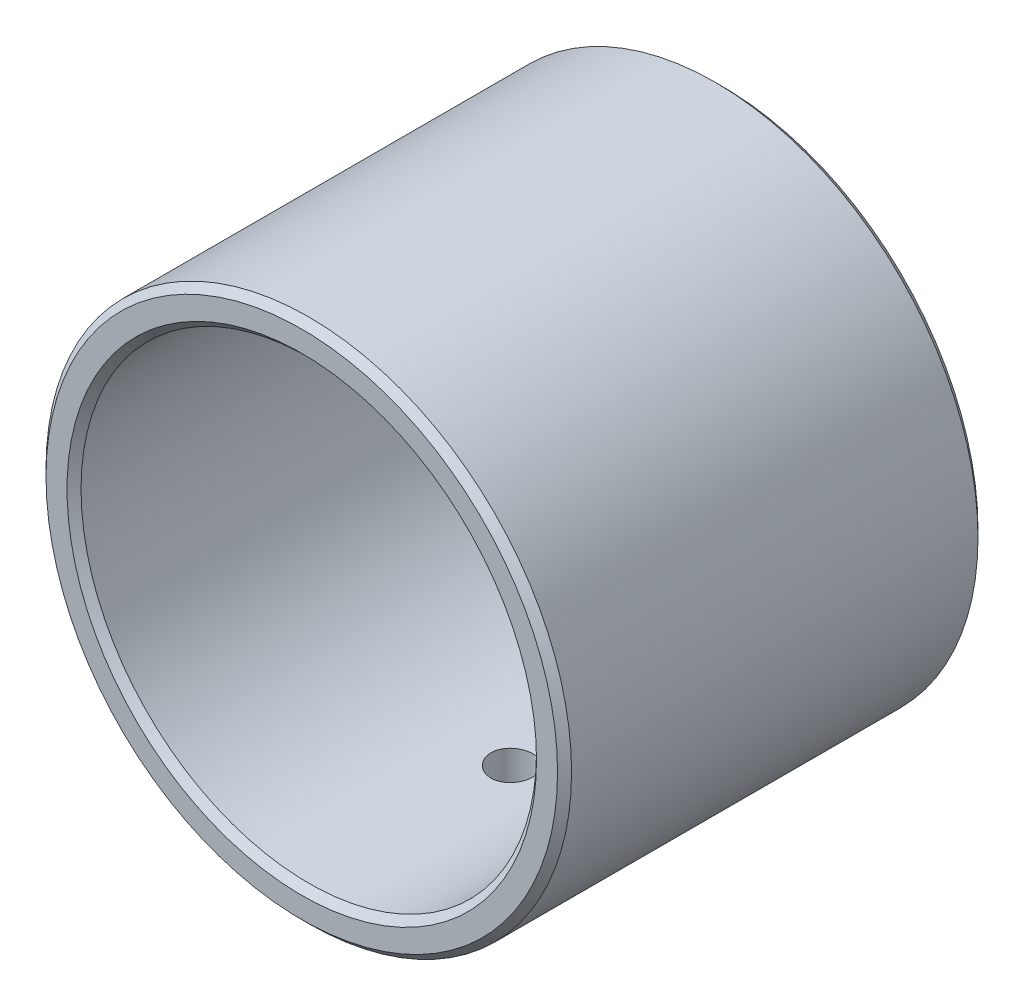
ISO-10303-21;
HEADER;
FILE_DESCRIPTION(('STEP AP214'),'2;1');
FILE_NAME('part.step','',(''),(''),'','','');
FILE_SCHEMA(('AUTOMOTIVE_DESIGN { 1 0 10303 214 1 1 1 1 }'));
ENDSEC;
DATA;
#1=APPLICATION_CONTEXT('core data for automotive mechanical design processes');
#2=APPLICATION_PROTOCOL_DEFINITION('international standard','automotive_design',2000,#1);
#3=PRODUCT_CONTEXT('',#1,'mechanical');
#4=PRODUCT('Part','Part','',(#3));
#5=PRODUCT_RELATED_PRODUCT_CATEGORY('part','',(#4));
#6=PRODUCT_DEFINITION_FORMATION('','',#4);
#7=PRODUCT_DEFINITION_CONTEXT('part definition',#1,'design');
#8=PRODUCT_DEFINITION('design','',#6,#7);
#9=PRODUCT_DEFINITION_SHAPE('','',#8);
#10=(LENGTH_UNIT() NAMED_UNIT(*) SI_UNIT(.MILLI.,.METRE.));
#11=(NAMED_UNIT(*) PLANE_ANGLE_UNIT() SI_UNIT($,.RADIAN.));
#12=(NAMED_UNIT(*) SI_UNIT($,.STERADIAN.) SOLID_ANGLE_UNIT());
#13=UNCERTAINTY_MEASURE_WITH_UNIT(LENGTH_MEASURE(1.E-05),#10,'distance_accuracy_value','');
#14=(GEOMETRIC_REPRESENTATION_CONTEXT(3) GLOBAL_UNCERTAINTY_ASSIGNED_CONTEXT((#13)) GLOBAL_UNIT_ASSIGNED_CONTEXT((#10,
#11,#12)) REPRESENTATION_CONTEXT('',''));
#15=CARTESIAN_POINT('',(0.,0.,0.));
#16=DIRECTION('',(0.,0.,1.));
#17=DIRECTION('',(1.,0.,0.));
#18=AXIS2_PLACEMENT_3D('',#15,#16,#17);
#19=CARTESIAN_POINT('',(0.,0.,30.));
#20=DIRECTION('',(0.,0.,1.));
#21=DIRECTION('',(1.,0.,0.));
#22=AXIS2_PLACEMENT_3D('',#19,#20,#21);
#23=PLANE('',#22);
#24=CARTESIAN_POINT('',(0.,0.,30.));
#25=DIRECTION('',(0.,0.,1.));
#26=DIRECTION('',(1.,0.,0.));
#27=AXIS2_PLACEMENT_3D('',#24,#25,#26);
#28=CIRCLE('',#27,36.5);
#29=CARTESIAN_POINT('',(36.5,0.,30.));
#30=VERTEX_POINT('',#29);
#31=EDGE_CURVE('E65',#30,#30,#28,.T.);
#32=ORIENTED_EDGE('',*,*,#31,.T.);
#33=EDGE_LOOP('',(#32));
#34=FACE_BOUND('',#33,.T.);
#35=CARTESIAN_POINT('',(0.,0.,30.));
#36=DIRECTION('',(0.,0.,1.));
#37=DIRECTION('',(1.,0.,0.));
#38=AXIS2_PLACEMENT_3D('',#35,#36,#37);
#39=CIRCLE('',#38,33.5);
#40=CARTESIAN_POINT('',(33.5,0.,30.));
#41=VERTEX_POINT('',#40);
#42=EDGE_CURVE('E71',#41,#41,#39,.F.);
#43=ORIENTED_EDGE('',*,*,#42,.T.);
#44=EDGE_LOOP('',(#43));
#45=FACE_BOUND('',#44,.T.);
#46=ADVANCED_FACE('F45',(#34,#45),#23,.T.);
#47=CARTESIAN_POINT('',(0.,0.,-30.));
#48=DIRECTION('',(0.,0.,1.));
#49=DIRECTION('',(1.,0.,0.));
#50=AXIS2_PLACEMENT_3D('',#47,#48,#49);
#51=PLANE('',#50);
#52=CARTESIAN_POINT('',(0.,0.,-30.));
#53=DIRECTION('',(0.,0.,1.));
#54=DIRECTION('',(1.,0.,0.));
#55=AXIS2_PLACEMENT_3D('',#52,#53,#54);
#56=CIRCLE('',#55,36.5);
#57=CARTESIAN_POINT('',(36.5,0.,-30.));
#58=VERTEX_POINT('',#57);
#59=EDGE_CURVE('E75',#58,#58,#56,.F.);
#60=ORIENTED_EDGE('',*,*,#59,.T.);
#61=EDGE_LOOP('',(#60));
#62=FACE_BOUND('',#61,.T.);
#63=CARTESIAN_POINT('',(0.,0.,-30.));
#64=DIRECTION('',(0.,0.,1.));
#65=DIRECTION('',(1.,0.,0.));
#66=AXIS2_PLACEMENT_3D('',#63,#64,#65);
#67=CIRCLE('',#66,33.5);
#68=CARTESIAN_POINT('',(33.5,0.,-30.));
#69=VERTEX_POINT('',#68);
#70=EDGE_CURVE('E79',#69,#69,#67,.T.);
#71=ORIENTED_EDGE('',*,*,#70,.T.);
#72=EDGE_LOOP('',(#71));
#73=FACE_BOUND('',#72,.T.);
#74=ADVANCED_FACE('F114',(#62,#73),#51,.F.);
#75=CARTESIAN_POINT('',(0.,0.,30.));
#76=DIRECTION('',(0.,0.,-1.));
#77=DIRECTION('',(-1.,0.,0.));
#78=AXIS2_PLACEMENT_3D('',#75,#76,#77);
#79=CYLINDRICAL_SURFACE('',#78,37.5);
#80=CARTESIAN_POINT('',(0.,-37.5,3.));
#81=CARTESIAN_POINT('',(0.168222751800886,-37.4999984236095,2.99999264213146));
#82=CARTESIAN_POINT('',(0.336560608990241,-37.4988559701592,2.98580296686298));
#83=CARTESIAN_POINT('',(0.668580435569917,-37.4944083384598,2.92940553201148));
#84=CARTESIAN_POINT('',(0.832256882809025,-37.4911006980462,2.887165874314));
#85=CARTESIAN_POINT('',(1.15009704002039,-37.4826965442418,2.77589627848769));
#86=CARTESIAN_POINT('',(1.3042660116941,-37.4776010309475,2.70688131559535));
#87=CARTESIAN_POINT('',(1.59879385208132,-37.4661928643068,2.54404654777991));
#88=CARTESIAN_POINT('',(1.73915570308135,-37.459880474677,2.45023211566322));
#89=CARTESIAN_POINT('',(2.00245380109379,-37.4467304386629,2.24022185332118));
#90=CARTESIAN_POINT('',(2.12535298270382,-37.4398917211575,2.12397961575353));
#91=CARTESIAN_POINT('',(2.34991920199031,-37.4264688081745,1.87251120407989));
#92=CARTESIAN_POINT('',(2.4515853153299,-37.4198846237878,1.73728420394061));
#93=CARTESIAN_POINT('',(2.63092348233475,-37.4077045690979,1.45146231625559));
#94=CARTESIAN_POINT('',(2.70856319361821,-37.4021100352811,1.30084707373721));
#95=CARTESIAN_POINT('',(2.83743801359472,-37.3925546851607,0.988666108061202));
#96=CARTESIAN_POINT('',(2.88867355580934,-37.3885938420342,0.827100564742332));
#97=CARTESIAN_POINT('',(2.96317873589194,-37.3827631384194,0.497974862967645));
#98=CARTESIAN_POINT('',(2.98650847260138,-37.3808887850061,0.330428390165994));
#99=CARTESIAN_POINT('',(3.00472543604187,-37.3794290066082,-0.00621202420978206));
#100=CARTESIAN_POINT('',(2.9996131585685,-37.3798435417242,-0.175305938757911));
#101=CARTESIAN_POINT('',(2.96114091267061,-37.3829106273543,-0.509829850416292));
#102=CARTESIAN_POINT('',(2.92784620794029,-37.3855580070888,-0.675267407267621));
#103=CARTESIAN_POINT('',(2.8340555869495,-37.392784363862,-0.99819836951401));
#104=CARTESIAN_POINT('',(2.77355942331381,-37.3973633584672,-1.15569170264831));
#105=CARTESIAN_POINT('',(2.62700989309947,-37.4079429439832,-1.45847185325913));
#106=CARTESIAN_POINT('',(2.54092718747945,-37.4139451652432,-1.60374441098139));
#107=CARTESIAN_POINT('',(2.34566931243017,-37.4266933587018,-1.87780332632068));
#108=CARTESIAN_POINT('',(2.23649371253521,-37.4334393447635,-2.00658937654726));
#109=CARTESIAN_POINT('',(1.99778282392639,-37.4469379388303,-2.24439903005793));
#110=CARTESIAN_POINT('',(1.86819110328975,-37.4536905120439,-2.35336599757502));
#111=CARTESIAN_POINT('',(1.59252365130534,-37.466423298605,-2.54800660480164));
#112=CARTESIAN_POINT('',(1.44644791004413,-37.4724035114879,-2.63368023050252));
#113=CARTESIAN_POINT('',(1.1419225962639,-37.4829187686353,-2.77929844322159));
#114=CARTESIAN_POINT('',(0.983471850365544,-37.4874536756504,-2.83924058691012));
#115=CARTESIAN_POINT('',(0.658710978114656,-37.4945657394204,-2.93165497252367));
#116=CARTESIAN_POINT('',(0.492401002142011,-37.4971429336184,-2.96412773982803));
#117=CARTESIAN_POINT('',(0.157133593038831,-37.5000443806913,-3.00061073091808));
#118=CARTESIAN_POINT('',(-0.0118152746798743,-37.5003748267442,-3.00469919689977));
#119=CARTESIAN_POINT('',(-0.347996097434141,-37.4987620734669,-2.98450240068434));
#120=CARTESIAN_POINT('',(-0.515228067198984,-37.4968188936585,-2.9602173821091));
#121=CARTESIAN_POINT('',(-0.84300537910553,-37.4908814438534,-2.88402781736591));
#122=CARTESIAN_POINT('',(-1.00355918859631,-37.4868898624262,-2.83215947165495));
#123=CARTESIAN_POINT('',(-1.31368476643416,-37.4773041268362,-2.70231254046201));
#124=CARTESIAN_POINT('',(-1.46325637432971,-37.4717099492651,-2.62433357359265));
#125=CARTESIAN_POINT('',(-1.74752822852129,-37.459530948373,-2.44428185541971));
#126=CARTESIAN_POINT('',(-1.88219550387659,-37.4529440019566,-2.34215719427601));
#127=CARTESIAN_POINT('',(-2.13250332558862,-37.4395268701338,-2.1167881192166));
#128=CARTESIAN_POINT('',(-2.24814356720047,-37.4326966808336,-1.99354336709725));
#129=CARTESIAN_POINT('',(-2.45738250836876,-37.4195445986419,-1.72909339955958));
#130=CARTESIAN_POINT('',(-2.55093020313446,-37.4132239037322,-1.58784776015822));
#131=CARTESIAN_POINT('',(-2.71297900671178,-37.4018231113086,-1.29160701991911));
#132=CARTESIAN_POINT('',(-2.78148034872571,-37.3967430022439,-1.13661204711577));
#133=CARTESIAN_POINT('',(-2.89140480195482,-37.3884050822585,-0.817453997496478));
#134=CARTESIAN_POINT('',(-2.93285929295261,-37.385145160191,-0.653301785907836));
#135=CARTESIAN_POINT('',(-2.9876155281387,-37.3808095113181,-0.320339776918988));
#136=CARTESIAN_POINT('',(-3.00091776586094,-37.3797337462225,-0.151530061221512));
#137=CARTESIAN_POINT('',(-2.99898638200556,-37.3798887128596,0.185448161170736));
#138=CARTESIAN_POINT('',(-2.98383290642986,-37.3811129665546,0.353617136018293));
#139=CARTESIAN_POINT('',(-2.9255871988486,-37.3857162698138,0.685013702794046));
#140=CARTESIAN_POINT('',(-2.88249492256476,-37.3890953227931,0.848241286890544));
#141=CARTESIAN_POINT('',(-2.76961478711444,-37.3976257968807,1.16512798617694));
#142=CARTESIAN_POINT('',(-2.69982819431719,-37.4027771339114,1.31878755486819));
#143=CARTESIAN_POINT('',(-2.53554962651441,-37.414271853065,1.61222235182583));
#144=CARTESIAN_POINT('',(-2.44105808416528,-37.4206152143114,1.75199782318449));
#145=CARTESIAN_POINT('',(-2.22975108466315,-37.4338004311269,2.01410651918904));
#146=CARTESIAN_POINT('',(-2.11287643044766,-37.4406435781146,2.13639195496124));
#147=CARTESIAN_POINT('',(-1.86022523046868,-37.4540455738936,2.35965777693092));
#148=CARTESIAN_POINT('',(-1.72444410914975,-37.4606043533598,2.46063299091416));
#149=CARTESIAN_POINT('',(-1.43759216060119,-37.4727095106455,2.63853623120068));
#150=CARTESIAN_POINT('',(-1.28649503074467,-37.4782540993685,2.71542192914662));
#151=CARTESIAN_POINT('',(-0.973595889607234,-37.4876847613678,2.84263430846973));
#152=CARTESIAN_POINT('',(-0.811806468977174,-37.4915727465466,2.8929916224765));
#153=CARTESIAN_POINT('',(-0.540880092680144,-37.4962502925848,2.95284544619265));
#154=CARTESIAN_POINT('',(-0.433487191692779,-37.4976500589054,2.9705050156844));
#155=CARTESIAN_POINT('',(-0.217412220673828,-37.4995254209448,2.99408465628644));
#156=CARTESIAN_POINT('',(-0.108730153754411,-37.5000010188942,3.00000475573113));
#157=CARTESIAN_POINT('',(0.,-37.5,3.));
#158=B_SPLINE_CURVE_WITH_KNOTS('',3,(#80,#81,#82,#83,#84,#85,#86,#87,#88,#89,#90,#91,#92,#93,
#94,#95,#96,#97,#98,#99,#100,#101,#102,#103,#104,#105,#106,#107,#108,#109,#110,#111,#112,#113,
#114,#115,#116,#117,#118,#119,#120,#121,#122,#123,#124,#125,#126,#127,#128,#129,#130,#131,#132,
#133,#134,#135,#136,#137,#138,#139,#140,#141,#142,#143,#144,#145,#146,#147,#148,#149,#150,#151,
#152,#153,#154,#155,#156,#157),.UNSPECIFIED.,.T.,.F.,(4,2,2,2,2,2,2,2,2,2,2,2,2,2,2,2,2,2,2,2,2,
2,2,2,2,2,2,2,2,2,2,2,2,2,2,2,2,2,4),(0.,0.504271281366636,1.00911699844654,1.51368076503646,
2.01813530732096,2.52364507749813,3.02917684939295,3.53538619615035,4.04158723135431,
4.54669612150751,5.05179620672999,5.5557297921749,6.05966796058011,6.56418621824545,
7.06871388126922,7.57466139439435,8.0806092117965,8.58660506078912,9.09259123188554,
9.59718208083727,10.1017685972766,10.605694520954,11.1096278055969,11.6146544880691,
12.1196892584713,12.6258788407328,13.1320637098293,13.6376602534859,14.143247933514,
14.6474137526382,15.1515803707819,15.6557230743998,16.1598569495862,16.6653430045412,
17.170951605523,17.6774437066255,18.1833496663815,18.5092843316213,18.8352182101838),.UNSPECIFIED.);
#159=CARTESIAN_POINT('',(0.,-37.5,3.));
#160=VERTEX_POINT('',#159);
#161=EDGE_CURVE('E91',#160,#160,#158,.T.);
#162=ORIENTED_EDGE('',*,*,#161,.T.);
#163=EDGE_LOOP('',(#162));
#164=FACE_BOUND('',#163,.T.);
#165=CARTESIAN_POINT('',(0.,0.,-29.));
#166=DIRECTION('',(0.,0.,1.));
#167=DIRECTION('',(1.,0.,0.));
#168=AXIS2_PLACEMENT_3D('',#165,#166,#167);
#169=CIRCLE('',#168,37.5);
#170=CARTESIAN_POINT('',(37.5,0.,-29.));
#171=VERTEX_POINT('',#170);
#172=EDGE_CURVE('E83',#171,#171,#169,.T.);
#173=ORIENTED_EDGE('',*,*,#172,.T.);
#174=EDGE_LOOP('',(#173));
#175=FACE_BOUND('',#174,.T.);
#176=CARTESIAN_POINT('',(0.,0.,29.));
#177=DIRECTION('',(0.,0.,1.));
#178=DIRECTION('',(1.,0.,0.));
#179=AXIS2_PLACEMENT_3D('',#176,#177,#178);
#180=CIRCLE('',#179,37.5);
#181=CARTESIAN_POINT('',(37.5,0.,29.));
#182=VERTEX_POINT('',#181);
#183=EDGE_CURVE('E87',#182,#182,#180,.F.);
#184=ORIENTED_EDGE('',*,*,#183,.T.);
#185=EDGE_LOOP('',(#184));
#186=FACE_BOUND('',#185,.T.);
#187=ADVANCED_FACE('F98',(#164,#175,#186),#79,.T.);
#188=CARTESIAN_POINT('',(0.,0.,30.));
#189=DIRECTION('',(0.,0.,-1.));
#190=DIRECTION('',(-1.,0.,0.));
#191=AXIS2_PLACEMENT_3D('',#188,#189,#190);
#192=CYLINDRICAL_SURFACE('',#191,32.5);
#193=CARTESIAN_POINT('',(0.,-32.5,3.));
#194=CARTESIAN_POINT('',(0.168127447858893,-32.499998200448,2.99999268796762));
#195=CARTESIAN_POINT('',(0.336367649952681,-32.4986814920313,2.98581901711867));
#196=CARTESIAN_POINT('',(0.668188333000889,-32.493555486346,2.92948886822067));
#197=CARTESIAN_POINT('',(0.831763396799108,-32.4897434053433,2.88730113809264));
#198=CARTESIAN_POINT('',(1.14940033427611,-32.4800571967355,2.77617750082649));
#199=CARTESIAN_POINT('',(1.30346771716235,-32.4741842767257,2.70725725572544));
#200=CARTESIAN_POINT('',(1.59781225884423,-32.4610340141874,2.54465425340714));
#201=CARTESIAN_POINT('',(1.73809225194731,-32.4537569612252,2.45097660029915));
#202=CARTESIAN_POINT('',(2.00134877377396,-32.4385891291439,2.24120636914854));
#203=CARTESIAN_POINT('',(2.12427674685288,-32.4306967201594,2.12505296724712));
#204=CARTESIAN_POINT('',(2.34892274347161,-32.4152012715689,1.87375764590794));
#205=CARTESIAN_POINT('',(2.45063981024983,-32.4075982450287,1.73861487037542));
#206=CARTESIAN_POINT('',(2.63014525015732,-32.3935253818631,1.45287745412308));
#207=CARTESIAN_POINT('',(2.70789024379315,-32.3870576085759,1.30225545128696));
#208=CARTESIAN_POINT('',(2.83696761101891,-32.3760071073872,0.990025371385429));
#209=CARTESIAN_POINT('',(2.88830054680513,-32.3714243393626,0.828417528243021));
#210=CARTESIAN_POINT('',(2.96295405934647,-32.3646770219344,0.499294703096719));
#211=CARTESIAN_POINT('',(2.98635455704954,-32.3625055744524,0.331797992981609));
#212=CARTESIAN_POINT('',(3.0047259176335,-32.3608051783161,-0.00475862849416239));
#213=CARTESIAN_POINT('',(2.99969742418622,-32.3612761698332,-0.173818504376055));
#214=CARTESIAN_POINT('',(2.96141949929613,-32.3648011490206,-0.50815311321259));
#215=CARTESIAN_POINT('',(2.92825713358416,-32.367847167667,-0.673437910108543));
#216=CARTESIAN_POINT('',(2.83478819453028,-32.376166521536,-0.996085538699962));
#217=CARTESIAN_POINT('',(2.77448130349781,-32.3814398828267,-1.15344827765431));
#218=CARTESIAN_POINT('',(2.62833843420106,-32.3936289230956,-1.45606105349976));
#219=CARTESIAN_POINT('',(2.54246361776321,-32.4005470973322,-1.6012922294163));
#220=CARTESIAN_POINT('',(2.34765051828282,-32.4152440631553,-1.87531297343855));
#221=CARTESIAN_POINT('',(2.23871166074655,-32.4230228761768,-2.00410213186795));
#222=CARTESIAN_POINT('',(2.00037558072721,-32.438600132379,-2.24208907322335));
#223=CARTESIAN_POINT('',(1.87090312869387,-32.4463985396991,-2.35121153276987));
#224=CARTESIAN_POINT('',(1.59543692703973,-32.461108627276,-2.54618436893318));
#225=CARTESIAN_POINT('',(1.44944316279449,-32.4680203067478,-2.63203472494957));
#226=CARTESIAN_POINT('',(1.14502793712232,-32.4801799739725,-2.77802254942167));
#227=CARTESIAN_POINT('',(0.986604745824075,-32.4854277296338,-2.83815643123557));
#228=CARTESIAN_POINT('',(0.661851290621108,-32.4936657751273,-2.93095031903285));
#229=CARTESIAN_POINT('',(0.495521228233373,-32.4966561224597,-2.96361102480998));
#230=CARTESIAN_POINT('',(0.160328116653699,-32.5000350399181,-3.0004364277425));
#231=CARTESIAN_POINT('',(-0.00852341628612371,-32.5004331044779,-3.00470511406755));
#232=CARTESIAN_POINT('',(-0.344539595481983,-32.498608015448,-2.98489808729171));
#233=CARTESIAN_POINT('',(-0.511704261082806,-32.4963848919524,-2.96082269961059));
#234=CARTESIAN_POINT('',(-0.839303131187056,-32.4895734302126,-2.88509716889747));
#235=CARTESIAN_POINT('',(-0.999748629555254,-32.4849892485227,-2.83349547920358));
#236=CARTESIAN_POINT('',(-1.30970517626086,-32.4739702807507,-2.7042317729149));
#237=CARTESIAN_POINT('',(-1.45921601403554,-32.4675354590436,-2.62656925464196));
#238=CARTESIAN_POINT('',(-1.7435308318508,-32.4535120754671,-2.44712889106618));
#239=CARTESIAN_POINT('',(-1.87829135430055,-32.4459202541178,-2.34528244800856));
#240=CARTESIAN_POINT('',(-2.12884087708942,-32.4304459457392,-2.12046399354003));
#241=CARTESIAN_POINT('',(-2.24462947246197,-32.4225634525099,-1.99749153129697));
#242=CARTESIAN_POINT('',(-2.45430728440356,-32.40736785749,-1.73345923398919));
#243=CARTESIAN_POINT('',(-2.54812843989217,-32.4000565708837,-1.59234523003172));
#244=CARTESIAN_POINT('',(-2.71074084051193,-32.3868579560753,-1.29630391648059));
#245=CARTESIAN_POINT('',(-2.77953238368145,-32.380970610918,-1.14137677139331));
#246=CARTESIAN_POINT('',(-2.89001791064886,-32.3712972984045,-0.822344066164599));
#247=CARTESIAN_POINT('',(-2.93175295489679,-32.3675081481468,-0.658252826317252));
#248=CARTESIAN_POINT('',(-2.9870742319988,-32.3624500225714,-0.325355191004596));
#249=CARTESIAN_POINT('',(-3.00066114250464,-32.3611809865833,-0.156548909150648));
#250=CARTESIAN_POINT('',(-2.99929183861713,-32.3613078734476,0.180310604048269));
#251=CARTESIAN_POINT('',(-2.98444254846719,-32.3626938132123,0.348364284075467));
#252=CARTESIAN_POINT('',(-2.92684595477801,-32.3679532426747,0.679579406699093));
#253=CARTESIAN_POINT('',(-2.88409861406569,-32.371826735687,0.842740842776489));
#254=CARTESIAN_POINT('',(-2.77194772428225,-32.3816221286228,1.1595428080858));
#255=CARTESIAN_POINT('',(-2.7025467423986,-32.3875438312644,1.31318425259611));
#256=CARTESIAN_POINT('',(-2.53907001400934,-32.400768801679,1.60665371875315));
#257=CARTESIAN_POINT('',(-2.44499452575423,-32.408072054992,1.74648188495254));
#258=CARTESIAN_POINT('',(-2.23443725279452,-32.4232700423983,2.00890339526476));
#259=CARTESIAN_POINT('',(-2.1178759678413,-32.4311668125809,2.13143283415984));
#260=CARTESIAN_POINT('',(-1.865808093898,-32.4466434254375,2.35524313986978));
#261=CARTESIAN_POINT('',(-1.73029695192598,-32.4542231913762,2.45651888550517));
#262=CARTESIAN_POINT('',(-1.4438576972043,-32.4682285668397,2.63511567021022));
#263=CARTESIAN_POINT('',(-1.29289637373157,-32.4746516045994,2.71238360228148));
#264=CARTESIAN_POINT('',(-0.980182615006461,-32.4855909453437,2.84037355228903));
#265=CARTESIAN_POINT('',(-0.818442699620088,-32.4901094173642,2.89112578379527));
#266=CARTESIAN_POINT('',(-0.546473514555154,-32.4955832263377,2.95185728452064));
#267=CARTESIAN_POINT('',(-0.437988057580651,-32.4972318820046,2.96988646223812));
#268=CARTESIAN_POINT('',(-0.219684446960932,-32.4994408549689,2.99396018877252));
#269=CARTESIAN_POINT('',(-0.109866297832472,-32.5000011759538,3.00000477819617));
#270=CARTESIAN_POINT('',(0.,-32.5,3.));
#271=B_SPLINE_CURVE_WITH_KNOTS('',3,(#193,#194,#195,#196,#197,#198,#199,#200,#201,#202,#203,
#204,#205,#206,#207,#208,#209,#210,#211,#212,#213,#214,#215,#216,#217,#218,#219,#220,#221,#222,
#223,#224,#225,#226,#227,#228,#229,#230,#231,#232,#233,#234,#235,#236,#237,#238,#239,#240,#241,
#242,#243,#244,#245,#246,#247,#248,#249,#250,#251,#252,#253,#254,#255,#256,#257,#258,#259,#260,
#261,#262,#263,#264,#265,#266,#267,#268,#269,#270),.UNSPECIFIED.,.T.,.F.,(4,2,2,2,2,2,2,2,2,2,2,
2,2,2,2,2,2,2,2,2,2,2,2,2,2,2,2,2,2,2,2,2,2,2,2,2,2,2,4),(0.,0.503981181554937,1.00852554390682,
1.51277474939159,2.01692007736225,2.5224493015993,3.02800132384241,3.53446288778502,
4.04091367094744,4.54591188497526,5.05089866518795,5.55432834265566,6.05776391225137,
6.56196814605929,7.06618494038337,7.57229364217661,8.07840279197414,8.58458250512703,
9.09074932453475,9.59506122160951,10.0993673287101,10.602788643157,11.1062196491596,
11.6110960650306,12.1159832563721,12.6224146160432,13.1288399452206,13.634494922228,
14.1401377257115,14.6438829714494,15.1476288884099,15.6513262984514,16.1550184368609,
16.6605251836408,17.1661535952009,17.6728926583025,18.1790530464158,18.508390908316,
18.8377276543371),.UNSPECIFIED.);
#272=CARTESIAN_POINT('',(0.,-32.5,3.));
#273=VERTEX_POINT('',#272);
#274=EDGE_CURVE('E50',#273,#273,#271,.T.);
#275=ORIENTED_EDGE('',*,*,#274,.F.);
#276=EDGE_LOOP('',(#275));
#277=FACE_BOUND('',#276,.T.);
#278=CARTESIAN_POINT('',(0.,0.,-29.));
#279=DIRECTION('',(0.,0.,1.));
#280=DIRECTION('',(1.,0.,0.));
#281=AXIS2_PLACEMENT_3D('',#278,#279,#280);
#282=CIRCLE('',#281,32.5);
#283=CARTESIAN_POINT('',(32.5,0.,-29.));
#284=VERTEX_POINT('',#283);
#285=EDGE_CURVE('E10',#284,#284,#282,.F.);
#286=ORIENTED_EDGE('',*,*,#285,.T.);
#287=EDGE_LOOP('',(#286));
#288=FACE_BOUND('',#287,.T.);
#289=CARTESIAN_POINT('',(0.,0.,29.));
#290=DIRECTION('',(0.,0.,1.));
#291=DIRECTION('',(1.,0.,0.));
#292=AXIS2_PLACEMENT_3D('',#289,#290,#291);
#293=CIRCLE('',#292,32.5);
#294=CARTESIAN_POINT('',(32.5,0.,29.));
#295=VERTEX_POINT('',#294);
#296=EDGE_CURVE('E60',#295,#295,#293,.T.);
#297=ORIENTED_EDGE('',*,*,#296,.T.);
#298=EDGE_LOOP('',(#297));
#299=FACE_BOUND('',#298,.T.);
#300=ADVANCED_FACE('F106',(#277,#288,#299),#192,.F.);
#301=CARTESIAN_POINT('',(0.,0.,-29.));
#302=DIRECTION('',(0.,0.,1.));
#303=DIRECTION('',(1.,0.,0.));
#304=AXIS2_PLACEMENT_3D('',#301,#302,#303);
#305=CONICAL_SURFACE('',#304,37.5,0.785398163397452);
#306=ORIENTED_EDGE('',*,*,#59,.F.);
#307=EDGE_LOOP('',(#306));
#308=FACE_BOUND('',#307,.T.);
#309=ORIENTED_EDGE('',*,*,#172,.F.);
#310=EDGE_LOOP('',(#309));
#311=FACE_BOUND('',#310,.T.);
#312=ADVANCED_FACE('F111',(#308,#311),#305,.T.);
#313=CARTESIAN_POINT('',(0.,0.,30.));
#314=DIRECTION('',(0.,0.,-1.));
#315=DIRECTION('',(-1.,0.,0.));
#316=AXIS2_PLACEMENT_3D('',#313,#314,#315);
#317=CONICAL_SURFACE('',#316,36.5,0.785398163397448);
#318=ORIENTED_EDGE('',*,*,#183,.F.);
#319=EDGE_LOOP('',(#318));
#320=FACE_BOUND('',#319,.T.);
#321=ORIENTED_EDGE('',*,*,#31,.F.);
#322=EDGE_LOOP('',(#321));
#323=FACE_BOUND('',#322,.T.);
#324=ADVANCED_FACE('F129',(#320,#323),#317,.T.);
#325=CARTESIAN_POINT('',(0.,0.,-30.));
#326=DIRECTION('',(0.,0.,-1.));
#327=DIRECTION('',(-1.,0.,0.));
#328=AXIS2_PLACEMENT_3D('',#325,#326,#327);
#329=CONICAL_SURFACE('',#328,33.5,0.785398163397445);
#330=ORIENTED_EDGE('',*,*,#285,.F.);
#331=EDGE_LOOP('',(#330));
#332=FACE_BOUND('',#331,.T.);
#333=ORIENTED_EDGE('',*,*,#70,.F.);
#334=EDGE_LOOP('',(#333));
#335=FACE_BOUND('',#334,.T.);
#336=ADVANCED_FACE('F127',(#332,#335),#329,.F.);
#337=CARTESIAN_POINT('',(0.,0.,29.));
#338=DIRECTION('',(0.,0.,1.));
#339=DIRECTION('',(1.,0.,0.));
#340=AXIS2_PLACEMENT_3D('',#337,#338,#339);
#341=CONICAL_SURFACE('',#340,32.5,0.785398163397455);
#342=ORIENTED_EDGE('',*,*,#42,.F.);
#343=EDGE_LOOP('',(#342));
#344=FACE_BOUND('',#343,.T.);
#345=ORIENTED_EDGE('',*,*,#296,.F.);
#346=EDGE_LOOP('',(#345));
#347=FACE_BOUND('',#346,.T.);
#348=ADVANCED_FACE('F48',(#344,#347),#341,.F.);
#349=CARTESIAN_POINT('',(0.,-37.5,0.));
#350=DIRECTION('',(0.,1.,0.));
#351=DIRECTION('',(0.,0.,1.));
#352=AXIS2_PLACEMENT_3D('',#349,#350,#351);
#353=CYLINDRICAL_SURFACE('',#352,3.);
#354=ORIENTED_EDGE('',*,*,#274,.T.);
#355=EDGE_LOOP('',(#354));
#356=FACE_BOUND('',#355,.T.);
#357=ORIENTED_EDGE('',*,*,#161,.F.);
#358=EDGE_LOOP('',(#357));
#359=FACE_BOUND('',#358,.T.);
#360=ADVANCED_FACE('F102',(#356,#359),#353,.F.);
#361=CLOSED_SHELL('',(#46,#74,#187,#300,#312,#324,#336,#348,#360));
#362=MANIFOLD_SOLID_BREP('B2',#361);
#363=ADVANCED_BREP_SHAPE_REPRESENTATION('',(#18,#362),#14);
#364=SHAPE_DEFINITION_REPRESENTATION(#9,#363);
ENDSEC;
END-ISO-10303-21;
